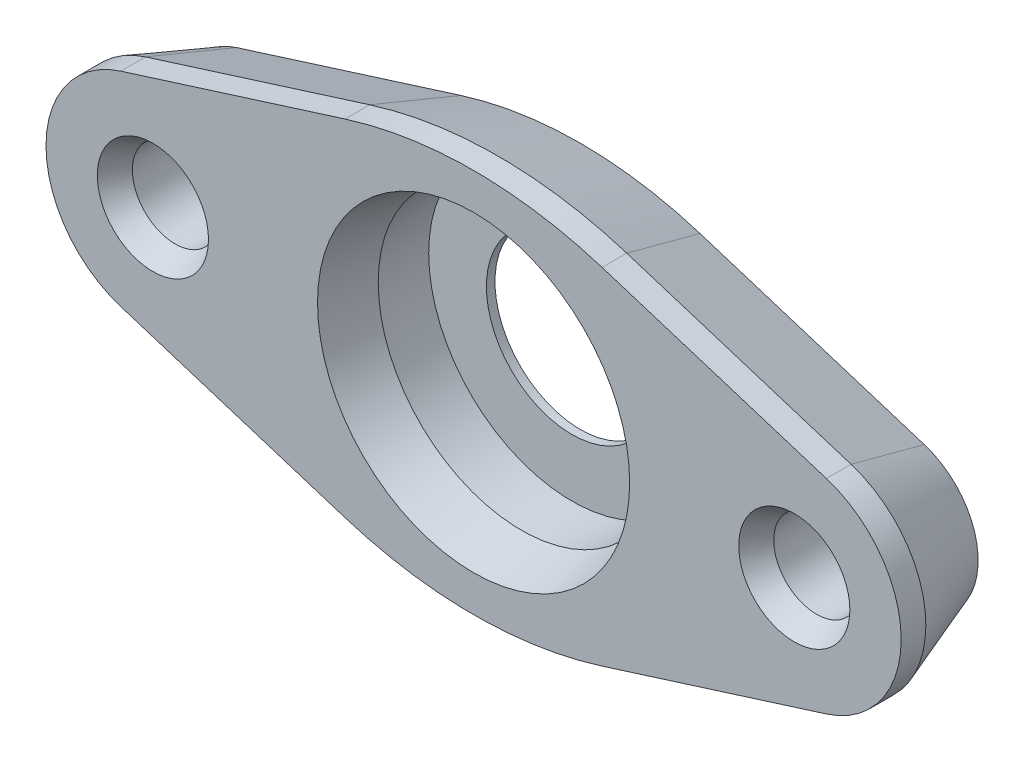
ISO-10303-21;
HEADER;
FILE_DESCRIPTION(('STEP AP214'),'2;1');
FILE_NAME('part.step','',(''),(''),'','','');
FILE_SCHEMA(('AUTOMOTIVE_DESIGN { 1 0 10303 214 1 1 1 1 }'));
ENDSEC;
DATA;
#1=APPLICATION_CONTEXT('core data for automotive mechanical design processes');
#2=APPLICATION_PROTOCOL_DEFINITION('international standard','automotive_design',2000,#1);
#3=PRODUCT_CONTEXT('',#1,'mechanical');
#4=PRODUCT('Part','Part','',(#3));
#5=PRODUCT_RELATED_PRODUCT_CATEGORY('part','',(#4));
#6=PRODUCT_DEFINITION_FORMATION('','',#4);
#7=PRODUCT_DEFINITION_CONTEXT('part definition',#1,'design');
#8=PRODUCT_DEFINITION('design','',#6,#7);
#9=PRODUCT_DEFINITION_SHAPE('','',#8);
#10=(LENGTH_UNIT() NAMED_UNIT(*) SI_UNIT(.MILLI.,.METRE.));
#11=(NAMED_UNIT(*) PLANE_ANGLE_UNIT() SI_UNIT($,.RADIAN.));
#12=(NAMED_UNIT(*) SI_UNIT($,.STERADIAN.) SOLID_ANGLE_UNIT());
#13=UNCERTAINTY_MEASURE_WITH_UNIT(LENGTH_MEASURE(1.E-05),#10,'distance_accuracy_value','');
#14=(GEOMETRIC_REPRESENTATION_CONTEXT(3) GLOBAL_UNCERTAINTY_ASSIGNED_CONTEXT((#13)) GLOBAL_UNIT_ASSIGNED_CONTEXT((#10,
#11,#12)) REPRESENTATION_CONTEXT('',''));
#15=CARTESIAN_POINT('',(0.,0.,0.));
#16=DIRECTION('',(0.,0.,1.));
#17=DIRECTION('',(1.,0.,0.));
#18=AXIS2_PLACEMENT_3D('',#15,#16,#17);
#19=CARTESIAN_POINT('',(-7.5,0.,2.5));
#20=DIRECTION('',(0.,0.,1.));
#21=DIRECTION('',(1.,0.,0.));
#22=AXIS2_PLACEMENT_3D('',#19,#20,#21);
#23=PLANE('',#22);
#24=CARTESIAN_POINT('',(7.5,0.,2.5));
#25=DIRECTION('',(0.,0.,1.));
#26=DIRECTION('',(1.,0.,0.));
#27=AXIS2_PLACEMENT_3D('',#24,#25,#26);
#28=CIRCLE('',#27,1.3);
#29=CARTESIAN_POINT('',(8.8,0.,2.5));
#30=VERTEX_POINT('',#29);
#31=EDGE_CURVE('E44',#30,#30,#28,.F.);
#32=ORIENTED_EDGE('',*,*,#31,.T.);
#33=EDGE_LOOP('',(#32));
#34=FACE_BOUND('',#33,.T.);
#35=CARTESIAN_POINT('',(-7.5,0.,2.5));
#36=DIRECTION('',(0.,0.,1.));
#37=DIRECTION('',(1.,0.,0.));
#38=AXIS2_PLACEMENT_3D('',#35,#36,#37);
#39=CIRCLE('',#38,1.3);
#40=CARTESIAN_POINT('',(-6.2,0.,2.5));
#41=VERTEX_POINT('',#40);
#42=EDGE_CURVE('E219',#41,#41,#39,.F.);
#43=ORIENTED_EDGE('',*,*,#42,.T.);
#44=EDGE_LOOP('',(#43));
#45=FACE_BOUND('',#44,.T.);
#46=CARTESIAN_POINT('',(0.,0.,2.5));
#47=DIRECTION('',(0.,0.,1.));
#48=DIRECTION('',(1.,0.,0.));
#49=AXIS2_PLACEMENT_3D('',#46,#47,#48);
#50=CIRCLE('',#49,3.65);
#51=CARTESIAN_POINT('',(3.65,0.,2.5));
#52=VERTEX_POINT('',#51);
#53=EDGE_CURVE('E213',#52,#52,#50,.F.);
#54=ORIENTED_EDGE('',*,*,#53,.T.);
#55=EDGE_LOOP('',(#54));
#56=FACE_BOUND('',#55,.T.);
#57=CARTESIAN_POINT('',(-7.5,0.,2.5));
#58=DIRECTION('',(0.,0.,1.));
#59=DIRECTION('',(1.,0.,0.));
#60=AXIS2_PLACEMENT_3D('',#57,#58,#59);
#61=CIRCLE('',#60,2.5);
#62=CARTESIAN_POINT('',(-8.25144508670521,2.38439306358381,2.5));
#63=VERTEX_POINT('',#62);
#64=CARTESIAN_POINT('',(-8.2514450867052,-2.38439306358382,2.5));
#65=VERTEX_POINT('',#64);
#66=EDGE_CURVE('E138',#63,#65,#61,.T.);
#67=ORIENTED_EDGE('',*,*,#66,.T.);
#68=DIRECTION('',(0.953757225433526,-0.300578034682081,0.));
#69=VECTOR('',#68,1.);
#70=CARTESIAN_POINT('',(-8.2514450867052,-2.38439306358382,2.5));
#71=LINE('',#70,#69);
#72=CARTESIAN_POINT('',(-3.00578034682081,-4.03757225433526,2.5));
#73=VERTEX_POINT('',#72);
#74=EDGE_CURVE('E128',#65,#73,#71,.T.);
#75=ORIENTED_EDGE('',*,*,#74,.T.);
#76=CARTESIAN_POINT('',(0.,5.5,2.5));
#77=DIRECTION('',(0.,0.,1.));
#78=DIRECTION('',(1.,0.,0.));
#79=AXIS2_PLACEMENT_3D('',#76,#77,#78);
#80=CIRCLE('',#79,10.);
#81=CARTESIAN_POINT('',(3.00578034682081,-4.03757225433526,2.5));
#82=VERTEX_POINT('',#81);
#83=EDGE_CURVE('E137',#73,#82,#80,.T.);
#84=ORIENTED_EDGE('',*,*,#83,.T.);
#85=DIRECTION('',(0.953757225433526,0.300578034682081,0.));
#86=VECTOR('',#85,1.);
#87=CARTESIAN_POINT('',(3.00578034682081,-4.03757225433526,2.5));
#88=LINE('',#87,#86);
#89=CARTESIAN_POINT('',(8.25144508670521,-2.38439306358381,2.5));
#90=VERTEX_POINT('',#89);
#91=EDGE_CURVE('E249',#82,#90,#88,.T.);
#92=ORIENTED_EDGE('',*,*,#91,.T.);
#93=CARTESIAN_POINT('',(7.5,0.,2.5));
#94=DIRECTION('',(0.,0.,1.));
#95=DIRECTION('',(1.,0.,0.));
#96=AXIS2_PLACEMENT_3D('',#93,#94,#95);
#97=CIRCLE('',#96,2.5);
#98=CARTESIAN_POINT('',(8.25144508670521,2.38439306358382,2.5));
#99=VERTEX_POINT('',#98);
#100=EDGE_CURVE('E251',#90,#99,#97,.T.);
#101=ORIENTED_EDGE('',*,*,#100,.T.);
#102=DIRECTION('',(-0.953757225433526,0.300578034682081,0.));
#103=VECTOR('',#102,1.);
#104=CARTESIAN_POINT('',(3.00578034682081,4.03757225433526,2.5));
#105=LINE('',#104,#103);
#106=CARTESIAN_POINT('',(3.00578034682081,4.03757225433526,2.5));
#107=VERTEX_POINT('',#106);
#108=EDGE_CURVE('E253',#99,#107,#105,.T.);
#109=ORIENTED_EDGE('',*,*,#108,.T.);
#110=CARTESIAN_POINT('',(0.,-5.5,2.5));
#111=DIRECTION('',(0.,0.,1.));
#112=DIRECTION('',(-1.,0.,0.));
#113=AXIS2_PLACEMENT_3D('',#110,#111,#112);
#114=CIRCLE('',#113,10.);
#115=CARTESIAN_POINT('',(-3.00578034682081,4.03757225433526,2.5));
#116=VERTEX_POINT('',#115);
#117=EDGE_CURVE('E255',#107,#116,#114,.T.);
#118=ORIENTED_EDGE('',*,*,#117,.T.);
#119=DIRECTION('',(-0.953757225433526,-0.300578034682081,0.));
#120=VECTOR('',#119,1.);
#121=CARTESIAN_POINT('',(-8.25144508670521,2.38439306358381,2.5));
#122=LINE('',#121,#120);
#123=EDGE_CURVE('E142',#116,#63,#122,.T.);
#124=ORIENTED_EDGE('',*,*,#123,.T.);
#125=EDGE_LOOP('',(#67,#75,#84,#92,#101,#109,#118,#124));
#126=FACE_BOUND('',#125,.T.);
#127=ADVANCED_FACE('F35',(#34,#45,#56,#126),#23,.T.);
#128=CARTESIAN_POINT('',(-7.5,0.,0.));
#129=DIRECTION('',(0.,0.,1.));
#130=DIRECTION('',(1.,0.,0.));
#131=AXIS2_PLACEMENT_3D('',#128,#129,#130);
#132=PLANE('',#131);
#133=CARTESIAN_POINT('',(0.,0.,0.));
#134=DIRECTION('',(0.,0.,1.));
#135=DIRECTION('',(1.,0.,0.));
#136=AXIS2_PLACEMENT_3D('',#133,#134,#135);
#137=CIRCLE('',#136,2.);
#138=CARTESIAN_POINT('',(2.,0.,0.));
#139=VERTEX_POINT('',#138);
#140=EDGE_CURVE('E39',#139,#139,#137,.T.);
#141=ORIENTED_EDGE('',*,*,#140,.T.);
#142=EDGE_LOOP('',(#141));
#143=FACE_BOUND('',#142,.T.);
#144=CARTESIAN_POINT('',(-7.5,0.,0.));
#145=DIRECTION('',(0.,0.,1.));
#146=DIRECTION('',(1.,0.,0.));
#147=AXIS2_PLACEMENT_3D('',#144,#145,#146);
#148=CIRCLE('',#147,1.8);
#149=CARTESIAN_POINT('',(-8.04104046242774,-1.71676300578035,0.));
#150=VERTEX_POINT('',#149);
#151=CARTESIAN_POINT('',(-8.04104046242775,1.71676300578034,0.));
#152=VERTEX_POINT('',#151);
#153=EDGE_CURVE('E171',#150,#152,#148,.F.);
#154=ORIENTED_EDGE('',*,*,#153,.T.);
#155=DIRECTION('',(0.953757225433526,0.300578034682081,0.));
#156=VECTOR('',#155,1.);
#157=CARTESIAN_POINT('',(-8.04104046242774,1.71676300578034,0.));
#158=LINE('',#157,#156);
#159=CARTESIAN_POINT('',(-2.79537572254335,3.36994219653179,0.));
#160=VERTEX_POINT('',#159);
#161=EDGE_CURVE('E173',#152,#160,#158,.T.);
#162=ORIENTED_EDGE('',*,*,#161,.T.);
#163=CARTESIAN_POINT('',(0.,-5.5,0.));
#164=DIRECTION('',(0.,0.,1.));
#165=DIRECTION('',(1.,0.,0.));
#166=AXIS2_PLACEMENT_3D('',#163,#164,#165);
#167=CIRCLE('',#166,9.3);
#168=CARTESIAN_POINT('',(2.79537572254335,3.36994219653179,0.));
#169=VERTEX_POINT('',#168);
#170=EDGE_CURVE('E169',#160,#169,#167,.F.);
#171=ORIENTED_EDGE('',*,*,#170,.T.);
#172=DIRECTION('',(0.953757225433526,-0.300578034682081,0.));
#173=VECTOR('',#172,1.);
#174=CARTESIAN_POINT('',(-5.60375221357212,6.01694009155,0.));
#175=LINE('',#174,#173);
#176=CARTESIAN_POINT('',(8.04104046242775,1.71676300578034,0.));
#177=VERTEX_POINT('',#176);
#178=EDGE_CURVE('E165',#169,#177,#175,.T.);
#179=ORIENTED_EDGE('',*,*,#178,.T.);
#180=CARTESIAN_POINT('',(7.5,0.,0.));
#181=DIRECTION('',(0.,0.,1.));
#182=DIRECTION('',(1.,0.,0.));
#183=AXIS2_PLACEMENT_3D('',#180,#181,#182);
#184=CIRCLE('',#183,1.8);
#185=CARTESIAN_POINT('',(8.04104046242775,-1.71676300578034,0.));
#186=VERTEX_POINT('',#185);
#187=EDGE_CURVE('E161',#177,#186,#184,.F.);
#188=ORIENTED_EDGE('',*,*,#187,.T.);
#189=DIRECTION('',(-0.953757225433526,-0.300578034682081,0.));
#190=VECTOR('',#189,1.);
#191=CARTESIAN_POINT('',(-5.60375221357212,-6.01694009155,0.));
#192=LINE('',#191,#190);
#193=CARTESIAN_POINT('',(2.79537572254335,-3.36994219653179,0.));
#194=VERTEX_POINT('',#193);
#195=EDGE_CURVE('E154',#186,#194,#192,.T.);
#196=ORIENTED_EDGE('',*,*,#195,.T.);
#197=CARTESIAN_POINT('',(0.,5.5,0.));
#198=DIRECTION('',(0.,0.,1.));
#199=DIRECTION('',(1.,0.,0.));
#200=AXIS2_PLACEMENT_3D('',#197,#198,#199);
#201=CIRCLE('',#200,9.3);
#202=CARTESIAN_POINT('',(-2.79537572254335,-3.36994219653179,0.));
#203=VERTEX_POINT('',#202);
#204=EDGE_CURVE('E163',#194,#203,#201,.F.);
#205=ORIENTED_EDGE('',*,*,#204,.T.);
#206=DIRECTION('',(-0.953757225433526,0.300578034682081,0.));
#207=VECTOR('',#206,1.);
#208=CARTESIAN_POINT('',(-8.04104046242774,-1.71676300578035,0.));
#209=LINE('',#208,#207);
#210=EDGE_CURVE('E167',#203,#150,#209,.T.);
#211=ORIENTED_EDGE('',*,*,#210,.T.);
#212=EDGE_LOOP('',(#154,#162,#171,#179,#188,#196,#205,#211));
#213=FACE_BOUND('',#212,.T.);
#214=CARTESIAN_POINT('',(7.5,0.,0.));
#215=DIRECTION('',(0.,0.,1.));
#216=DIRECTION('',(1.,0.,0.));
#217=AXIS2_PLACEMENT_3D('',#214,#215,#216);
#218=CIRCLE('',#217,1.);
#219=CARTESIAN_POINT('',(8.5,0.,0.));
#220=VERTEX_POINT('',#219);
#221=EDGE_CURVE('E146',#220,#220,#218,.T.);
#222=ORIENTED_EDGE('',*,*,#221,.T.);
#223=EDGE_LOOP('',(#222));
#224=FACE_BOUND('',#223,.T.);
#225=CARTESIAN_POINT('',(-7.5,0.,0.));
#226=DIRECTION('',(0.,0.,1.));
#227=DIRECTION('',(1.,0.,0.));
#228=AXIS2_PLACEMENT_3D('',#225,#226,#227);
#229=CIRCLE('',#228,1.);
#230=CARTESIAN_POINT('',(-6.5,0.,0.));
#231=VERTEX_POINT('',#230);
#232=EDGE_CURVE('E242',#231,#231,#229,.T.);
#233=ORIENTED_EDGE('',*,*,#232,.T.);
#234=EDGE_LOOP('',(#233));
#235=FACE_BOUND('',#234,.T.);
#236=ADVANCED_FACE('F284',(#143,#213,#224,#235),#132,.F.);
#237=CARTESIAN_POINT('',(-7.5,0.,2.5));
#238=DIRECTION('',(0.,0.,-1.));
#239=DIRECTION('',(-1.,0.,0.));
#240=AXIS2_PLACEMENT_3D('',#237,#238,#239);
#241=CYLINDRICAL_SURFACE('',#240,2.5);
#242=DIRECTION('',(0.,0.,-1.));
#243=VECTOR('',#242,1.);
#244=CARTESIAN_POINT('',(-8.25144508670521,2.38439306358381,2.5));
#245=LINE('',#244,#243);
#246=CARTESIAN_POINT('',(-8.25144508670521,2.38439306358381,1.92323419361825));
#247=VERTEX_POINT('',#246);
#248=EDGE_CURVE('E258',#63,#247,#245,.T.);
#249=ORIENTED_EDGE('',*,*,#248,.T.);
#250=CARTESIAN_POINT('',(-7.5,0.,1.92323419361825));
#251=DIRECTION('',(0.,0.,1.));
#252=DIRECTION('',(1.,0.,0.));
#253=AXIS2_PLACEMENT_3D('',#250,#251,#252);
#254=CIRCLE('',#253,2.5);
#255=CARTESIAN_POINT('',(-8.2514450867052,-2.38439306358382,1.92323419361825));
#256=VERTEX_POINT('',#255);
#257=EDGE_CURVE('E150',#247,#256,#254,.T.);
#258=ORIENTED_EDGE('',*,*,#257,.T.);
#259=DIRECTION('',(0.,0.,-1.));
#260=VECTOR('',#259,1.);
#261=CARTESIAN_POINT('',(-8.2514450867052,-2.38439306358382,2.5));
#262=LINE('',#261,#260);
#263=EDGE_CURVE('E132',#65,#256,#262,.T.);
#264=ORIENTED_EDGE('',*,*,#263,.F.);
#265=ORIENTED_EDGE('',*,*,#66,.F.);
#266=EDGE_LOOP('',(#249,#258,#264,#265));
#267=FACE_BOUND('',#266,.T.);
#268=ADVANCED_FACE('F148',(#267),#241,.T.);
#269=CARTESIAN_POINT('',(-8.2514450867052,-2.38439306358382,2.5));
#270=DIRECTION('',(0.300578034682081,0.953757225433526,0.));
#271=DIRECTION('',(-0.953757225433526,0.300578034682081,0.));
#272=AXIS2_PLACEMENT_3D('',#269,#270,#271);
#273=PLANE('',#272);
#274=ORIENTED_EDGE('',*,*,#263,.T.);
#275=DIRECTION('',(0.953757225433526,-0.300578034682081,0.));
#276=VECTOR('',#275,1.);
#277=CARTESIAN_POINT('',(-8.2514450867052,-2.38439306358382,1.92323419361825));
#278=LINE('',#277,#276);
#279=CARTESIAN_POINT('',(-3.00578034682081,-4.03757225433526,1.92323419361825));
#280=VERTEX_POINT('',#279);
#281=EDGE_CURVE('E179',#256,#280,#278,.T.);
#282=ORIENTED_EDGE('',*,*,#281,.T.);
#283=DIRECTION('',(0.,0.,-1.));
#284=VECTOR('',#283,1.);
#285=CARTESIAN_POINT('',(-3.00578034682081,-4.03757225433526,2.5));
#286=LINE('',#285,#284);
#287=EDGE_CURVE('E134',#73,#280,#286,.T.);
#288=ORIENTED_EDGE('',*,*,#287,.F.);
#289=ORIENTED_EDGE('',*,*,#74,.F.);
#290=EDGE_LOOP('',(#274,#282,#288,#289));
#291=FACE_BOUND('',#290,.T.);
#292=ADVANCED_FACE('F130',(#291),#273,.F.);
#293=CARTESIAN_POINT('',(0.,5.5,2.5));
#294=DIRECTION('',(0.,0.,-1.));
#295=DIRECTION('',(-1.,0.,0.));
#296=AXIS2_PLACEMENT_3D('',#293,#294,#295);
#297=CYLINDRICAL_SURFACE('',#296,10.);
#298=ORIENTED_EDGE('',*,*,#287,.T.);
#299=CARTESIAN_POINT('',(0.,5.5,1.92323419361825));
#300=DIRECTION('',(0.,0.,1.));
#301=DIRECTION('',(1.,0.,0.));
#302=AXIS2_PLACEMENT_3D('',#299,#300,#301);
#303=CIRCLE('',#302,10.);
#304=CARTESIAN_POINT('',(3.00578034682081,-4.03757225433526,1.92323419361825));
#305=VERTEX_POINT('',#304);
#306=EDGE_CURVE('E59',#280,#305,#303,.T.);
#307=ORIENTED_EDGE('',*,*,#306,.T.);
#308=DIRECTION('',(0.,0.,-1.));
#309=VECTOR('',#308,1.);
#310=CARTESIAN_POINT('',(3.00578034682081,-4.03757225433526,2.5));
#311=LINE('',#310,#309);
#312=EDGE_CURVE('E156',#82,#305,#311,.T.);
#313=ORIENTED_EDGE('',*,*,#312,.F.);
#314=ORIENTED_EDGE('',*,*,#83,.F.);
#315=EDGE_LOOP('',(#298,#307,#313,#314));
#316=FACE_BOUND('',#315,.T.);
#317=ADVANCED_FACE('F301',(#316),#297,.T.);
#318=CARTESIAN_POINT('',(3.00578034682081,-4.03757225433526,2.5));
#319=DIRECTION('',(-0.300578034682081,0.953757225433526,0.));
#320=DIRECTION('',(-0.953757225433526,-0.300578034682081,0.));
#321=AXIS2_PLACEMENT_3D('',#318,#319,#320);
#322=PLANE('',#321);
#323=ORIENTED_EDGE('',*,*,#312,.T.);
#324=DIRECTION('',(0.953757225433526,0.300578034682081,0.));
#325=VECTOR('',#324,1.);
#326=CARTESIAN_POINT('',(3.00578034682081,-4.03757225433526,1.92323419361825));
#327=LINE('',#326,#325);
#328=CARTESIAN_POINT('',(8.25144508670521,-2.38439306358381,1.92323419361825));
#329=VERTEX_POINT('',#328);
#330=EDGE_CURVE('E51',#305,#329,#327,.T.);
#331=ORIENTED_EDGE('',*,*,#330,.T.);
#332=DIRECTION('',(0.,0.,-1.));
#333=VECTOR('',#332,1.);
#334=CARTESIAN_POINT('',(8.25144508670521,-2.38439306358381,2.5));
#335=LINE('',#334,#333);
#336=EDGE_CURVE('E269',#90,#329,#335,.T.);
#337=ORIENTED_EDGE('',*,*,#336,.F.);
#338=ORIENTED_EDGE('',*,*,#91,.F.);
#339=EDGE_LOOP('',(#323,#331,#337,#338));
#340=FACE_BOUND('',#339,.T.);
#341=ADVANCED_FACE('F271',(#340),#322,.F.);
#342=CARTESIAN_POINT('',(7.5,0.,2.5));
#343=DIRECTION('',(0.,0.,-1.));
#344=DIRECTION('',(-1.,0.,0.));
#345=AXIS2_PLACEMENT_3D('',#342,#343,#344);
#346=CYLINDRICAL_SURFACE('',#345,2.5);
#347=ORIENTED_EDGE('',*,*,#336,.T.);
#348=CARTESIAN_POINT('',(7.5,0.,1.92323419361825));
#349=DIRECTION('',(0.,0.,1.));
#350=DIRECTION('',(1.,0.,0.));
#351=AXIS2_PLACEMENT_3D('',#348,#349,#350);
#352=CIRCLE('',#351,2.5);
#353=CARTESIAN_POINT('',(8.25144508670521,2.38439306358382,1.92323419361825));
#354=VERTEX_POINT('',#353);
#355=EDGE_CURVE('E184',#329,#354,#352,.T.);
#356=ORIENTED_EDGE('',*,*,#355,.T.);
#357=DIRECTION('',(0.,0.,-1.));
#358=VECTOR('',#357,1.);
#359=CARTESIAN_POINT('',(8.25144508670521,2.38439306358382,2.5));
#360=LINE('',#359,#358);
#361=EDGE_CURVE('E266',#99,#354,#360,.T.);
#362=ORIENTED_EDGE('',*,*,#361,.F.);
#363=ORIENTED_EDGE('',*,*,#100,.F.);
#364=EDGE_LOOP('',(#347,#356,#362,#363));
#365=FACE_BOUND('',#364,.T.);
#366=ADVANCED_FACE('F293',(#365),#346,.T.);
#367=CARTESIAN_POINT('',(3.00578034682081,4.03757225433526,2.5));
#368=DIRECTION('',(-0.300578034682081,-0.953757225433526,0.));
#369=DIRECTION('',(0.953757225433526,-0.300578034682081,0.));
#370=AXIS2_PLACEMENT_3D('',#367,#368,#369);
#371=PLANE('',#370);
#372=ORIENTED_EDGE('',*,*,#361,.T.);
#373=DIRECTION('',(-0.953757225433526,0.300578034682081,0.));
#374=VECTOR('',#373,1.);
#375=CARTESIAN_POINT('',(3.00578034682081,4.03757225433526,1.92323419361825));
#376=LINE('',#375,#374);
#377=CARTESIAN_POINT('',(3.00578034682081,4.03757225433526,1.92323419361825));
#378=VERTEX_POINT('',#377);
#379=EDGE_CURVE('E181',#354,#378,#376,.T.);
#380=ORIENTED_EDGE('',*,*,#379,.T.);
#381=DIRECTION('',(0.,0.,-1.));
#382=VECTOR('',#381,1.);
#383=CARTESIAN_POINT('',(3.00578034682081,4.03757225433526,2.5));
#384=LINE('',#383,#382);
#385=EDGE_CURVE('E263',#107,#378,#384,.T.);
#386=ORIENTED_EDGE('',*,*,#385,.F.);
#387=ORIENTED_EDGE('',*,*,#108,.F.);
#388=EDGE_LOOP('',(#372,#380,#386,#387));
#389=FACE_BOUND('',#388,.T.);
#390=ADVANCED_FACE('F297',(#389),#371,.F.);
#391=CARTESIAN_POINT('',(0.,-5.5,2.5));
#392=DIRECTION('',(0.,0.,-1.));
#393=DIRECTION('',(-1.,0.,0.));
#394=AXIS2_PLACEMENT_3D('',#391,#392,#393);
#395=CYLINDRICAL_SURFACE('',#394,10.);
#396=ORIENTED_EDGE('',*,*,#385,.T.);
#397=CARTESIAN_POINT('',(0.,-5.5,1.92323419361825));
#398=DIRECTION('',(0.,0.,1.));
#399=DIRECTION('',(1.,0.,0.));
#400=AXIS2_PLACEMENT_3D('',#397,#398,#399);
#401=CIRCLE('',#400,10.);
#402=CARTESIAN_POINT('',(-3.00578034682081,4.03757225433526,1.92323419361825));
#403=VERTEX_POINT('',#402);
#404=EDGE_CURVE('E177',#378,#403,#401,.T.);
#405=ORIENTED_EDGE('',*,*,#404,.T.);
#406=DIRECTION('',(0.,0.,-1.));
#407=VECTOR('',#406,1.);
#408=CARTESIAN_POINT('',(-3.00578034682081,4.03757225433526,2.5));
#409=LINE('',#408,#407);
#410=EDGE_CURVE('E260',#116,#403,#409,.T.);
#411=ORIENTED_EDGE('',*,*,#410,.F.);
#412=ORIENTED_EDGE('',*,*,#117,.F.);
#413=EDGE_LOOP('',(#396,#405,#411,#412));
#414=FACE_BOUND('',#413,.T.);
#415=ADVANCED_FACE('F321',(#414),#395,.T.);
#416=CARTESIAN_POINT('',(-8.25144508670521,2.38439306358381,2.5));
#417=DIRECTION('',(0.300578034682081,-0.953757225433526,0.));
#418=DIRECTION('',(0.953757225433526,0.300578034682081,0.));
#419=AXIS2_PLACEMENT_3D('',#416,#417,#418);
#420=PLANE('',#419);
#421=ORIENTED_EDGE('',*,*,#410,.T.);
#422=DIRECTION('',(-0.953757225433526,-0.300578034682081,0.));
#423=VECTOR('',#422,1.);
#424=CARTESIAN_POINT('',(-8.25144508670521,2.38439306358381,1.92323419361825));
#425=LINE('',#424,#423);
#426=EDGE_CURVE('E151',#403,#247,#425,.T.);
#427=ORIENTED_EDGE('',*,*,#426,.T.);
#428=ORIENTED_EDGE('',*,*,#248,.F.);
#429=ORIENTED_EDGE('',*,*,#123,.F.);
#430=EDGE_LOOP('',(#421,#427,#428,#429));
#431=FACE_BOUND('',#430,.T.);
#432=ADVANCED_FACE('F237',(#431),#420,.F.);
#433=CARTESIAN_POINT('',(7.5,0.,2.5));
#434=DIRECTION('',(0.,0.,-1.));
#435=DIRECTION('',(-1.,0.,0.));
#436=AXIS2_PLACEMENT_3D('',#433,#434,#435);
#437=CYLINDRICAL_SURFACE('',#436,1.);
#438=CARTESIAN_POINT('',(7.5,0.,1.98038475772934));
#439=DIRECTION('',(0.,0.,1.));
#440=DIRECTION('',(1.,0.,0.));
#441=AXIS2_PLACEMENT_3D('',#438,#439,#440);
#442=CIRCLE('',#441,1.);
#443=CARTESIAN_POINT('',(8.5,0.,1.98038475772934));
#444=VERTEX_POINT('',#443);
#445=EDGE_CURVE('E216',#444,#444,#442,.T.);
#446=ORIENTED_EDGE('',*,*,#445,.T.);
#447=EDGE_LOOP('',(#446));
#448=FACE_BOUND('',#447,.T.);
#449=ORIENTED_EDGE('',*,*,#221,.F.);
#450=EDGE_LOOP('',(#449));
#451=FACE_BOUND('',#450,.T.);
#452=ADVANCED_FACE('F233',(#448,#451),#437,.F.);
#453=CARTESIAN_POINT('',(-7.5,0.,2.5));
#454=DIRECTION('',(0.,0.,-1.));
#455=DIRECTION('',(-1.,0.,0.));
#456=AXIS2_PLACEMENT_3D('',#453,#454,#455);
#457=CYLINDRICAL_SURFACE('',#456,1.);
#458=CARTESIAN_POINT('',(-7.5,0.,1.98038475772934));
#459=DIRECTION('',(0.,0.,1.));
#460=DIRECTION('',(1.,0.,0.));
#461=AXIS2_PLACEMENT_3D('',#458,#459,#460);
#462=CIRCLE('',#461,1.);
#463=CARTESIAN_POINT('',(-6.5,0.,1.98038475772934));
#464=VERTEX_POINT('',#463);
#465=EDGE_CURVE('E11',#464,#464,#462,.T.);
#466=ORIENTED_EDGE('',*,*,#465,.T.);
#467=EDGE_LOOP('',(#466));
#468=FACE_BOUND('',#467,.T.);
#469=ORIENTED_EDGE('',*,*,#232,.F.);
#470=EDGE_LOOP('',(#469));
#471=FACE_BOUND('',#470,.T.);
#472=ADVANCED_FACE('F236',(#468,#471),#457,.F.);
#473=CARTESIAN_POINT('',(0.,0.,0.2));
#474=DIRECTION('',(0.,0.,1.));
#475=DIRECTION('',(1.,0.,0.));
#476=AXIS2_PLACEMENT_3D('',#473,#474,#475);
#477=CYLINDRICAL_SURFACE('',#476,3.35);
#478=CARTESIAN_POINT('',(0.,0.,1.38038475772935));
#479=DIRECTION('',(0.,0.,1.));
#480=DIRECTION('',(1.,0.,0.));
#481=AXIS2_PLACEMENT_3D('',#478,#479,#480);
#482=CIRCLE('',#481,3.35);
#483=CARTESIAN_POINT('',(3.35,0.,1.38038475772935));
#484=VERTEX_POINT('',#483);
#485=EDGE_CURVE('E187',#484,#484,#482,.T.);
#486=ORIENTED_EDGE('',*,*,#485,.T.);
#487=EDGE_LOOP('',(#486));
#488=FACE_BOUND('',#487,.T.);
#489=CARTESIAN_POINT('',(0.,0.,0.2));
#490=DIRECTION('',(0.,0.,1.));
#491=DIRECTION('',(1.,0.,0.));
#492=AXIS2_PLACEMENT_3D('',#489,#490,#491);
#493=CIRCLE('',#492,3.35);
#494=CARTESIAN_POINT('',(3.35,0.,0.2));
#495=VERTEX_POINT('',#494);
#496=EDGE_CURVE('E210',#495,#495,#493,.T.);
#497=ORIENTED_EDGE('',*,*,#496,.F.);
#498=EDGE_LOOP('',(#497));
#499=FACE_BOUND('',#498,.T.);
#500=ADVANCED_FACE('F356',(#488,#499),#477,.F.);
#501=CARTESIAN_POINT('',(0.,0.,0.2));
#502=DIRECTION('',(0.,0.,1.));
#503=DIRECTION('',(1.,0.,0.));
#504=AXIS2_PLACEMENT_3D('',#501,#502,#503);
#505=PLANE('',#504);
#506=CARTESIAN_POINT('',(0.,0.,0.2));
#507=DIRECTION('',(0.,0.,1.));
#508=DIRECTION('',(1.,0.,0.));
#509=AXIS2_PLACEMENT_3D('',#506,#507,#508);
#510=CIRCLE('',#509,2.);
#511=CARTESIAN_POINT('',(2.,0.,0.2));
#512=VERTEX_POINT('',#511);
#513=EDGE_CURVE('E531',#512,#512,#510,.T.);
#514=ORIENTED_EDGE('',*,*,#513,.F.);
#515=EDGE_LOOP('',(#514));
#516=FACE_BOUND('',#515,.T.);
#517=ORIENTED_EDGE('',*,*,#496,.T.);
#518=EDGE_LOOP('',(#517));
#519=FACE_BOUND('',#518,.T.);
#520=ADVANCED_FACE('F364',(#516,#519),#505,.T.);
#521=CARTESIAN_POINT('',(3.00578034682081,-4.03757225433526,1.92323419361825));
#522=DIRECTION('',(-0.282450961161083,0.896238626761127,0.342020143325668));
#523=DIRECTION('',(0.953757225433526,0.300578034682081,0.));
#524=AXIS2_PLACEMENT_3D('',#521,#522,#523);
#525=PLANE('',#524);
#526=DIRECTION('',(0.102803742502513,-0.326204182940666,0.939692620785909));
#527=VECTOR('',#526,1.);
#528=CARTESIAN_POINT('',(2.79537572254335,-3.36994219653179,0.));
#529=LINE('',#528,#527);
#530=EDGE_CURVE('E204',#194,#305,#529,.T.);
#531=ORIENTED_EDGE('',*,*,#530,.F.);
#532=ORIENTED_EDGE('',*,*,#195,.F.);
#533=DIRECTION('',(-0.102803742502514,0.326204182940666,-0.939692620785909));
#534=VECTOR('',#533,1.);
#535=CARTESIAN_POINT('',(8.25144508670521,-2.38439306358381,1.92323419361825));
#536=LINE('',#535,#534);
#537=EDGE_CURVE('E207',#329,#186,#536,.T.);
#538=ORIENTED_EDGE('',*,*,#537,.F.);
#539=ORIENTED_EDGE('',*,*,#330,.F.);
#540=EDGE_LOOP('',(#531,#532,#538,#539));
#541=FACE_BOUND('',#540,.T.);
#542=ADVANCED_FACE('F275',(#541),#525,.F.);
#543=CARTESIAN_POINT('',(7.5,0.,1.92323419361825));
#544=DIRECTION('',(0.,0.,1.));
#545=DIRECTION('',(1.,0.,0.));
#546=AXIS2_PLACEMENT_3D('',#543,#544,#545);
#547=CONICAL_SURFACE('',#546,2.5,0.349065850398866);
#548=ORIENTED_EDGE('',*,*,#537,.T.);
#549=ORIENTED_EDGE('',*,*,#187,.F.);
#550=DIRECTION('',(-0.102803742502513,-0.326204182940666,-0.939692620785909));
#551=VECTOR('',#550,1.);
#552=CARTESIAN_POINT('',(8.25144508670521,2.38439306358382,1.92323419361825));
#553=LINE('',#552,#551);
#554=EDGE_CURVE('E201',#354,#177,#553,.T.);
#555=ORIENTED_EDGE('',*,*,#554,.F.);
#556=ORIENTED_EDGE('',*,*,#355,.F.);
#557=EDGE_LOOP('',(#548,#549,#555,#556));
#558=FACE_BOUND('',#557,.T.);
#559=ADVANCED_FACE('F288',(#558),#547,.T.);
#560=CARTESIAN_POINT('',(0.,5.5,1.92323419361825));
#561=DIRECTION('',(0.,0.,1.));
#562=DIRECTION('',(1.,0.,0.));
#563=AXIS2_PLACEMENT_3D('',#560,#561,#562);
#564=CONICAL_SURFACE('',#563,10.,0.349065850398865);
#565=ORIENTED_EDGE('',*,*,#530,.T.);
#566=ORIENTED_EDGE('',*,*,#306,.F.);
#567=DIRECTION('',(-0.102803742502513,-0.326204182940666,0.939692620785909));
#568=VECTOR('',#567,1.);
#569=CARTESIAN_POINT('',(-2.79537572254335,-3.36994219653179,0.));
#570=LINE('',#569,#568);
#571=EDGE_CURVE('E198',#203,#280,#570,.T.);
#572=ORIENTED_EDGE('',*,*,#571,.F.);
#573=ORIENTED_EDGE('',*,*,#204,.F.);
#574=EDGE_LOOP('',(#565,#566,#572,#573));
#575=FACE_BOUND('',#574,.T.);
#576=ADVANCED_FACE('F280',(#575),#564,.T.);
#577=CARTESIAN_POINT('',(3.00578034682081,4.03757225433526,1.92323419361825));
#578=DIRECTION('',(-0.282450961161083,-0.896238626761127,0.342020143325668));
#579=DIRECTION('',(-0.953757225433526,0.300578034682081,0.));
#580=AXIS2_PLACEMENT_3D('',#577,#578,#579);
#581=PLANE('',#580);
#582=ORIENTED_EDGE('',*,*,#554,.T.);
#583=ORIENTED_EDGE('',*,*,#178,.F.);
#584=DIRECTION('',(-0.102803742502513,-0.326204182940666,-0.939692620785909));
#585=VECTOR('',#584,1.);
#586=CARTESIAN_POINT('',(3.00578034682081,4.03757225433526,1.92323419361825));
#587=LINE('',#586,#585);
#588=EDGE_CURVE('E195',#378,#169,#587,.T.);
#589=ORIENTED_EDGE('',*,*,#588,.F.);
#590=ORIENTED_EDGE('',*,*,#379,.F.);
#591=EDGE_LOOP('',(#582,#583,#589,#590));
#592=FACE_BOUND('',#591,.T.);
#593=ADVANCED_FACE('F394',(#592),#581,.F.);
#594=CARTESIAN_POINT('',(-8.2514450867052,-2.38439306358382,1.92323419361825));
#595=DIRECTION('',(0.282450961161082,0.896238626761127,0.342020143325668));
#596=DIRECTION('',(0.953757225433526,-0.300578034682081,0.));
#597=AXIS2_PLACEMENT_3D('',#594,#595,#596);
#598=PLANE('',#597);
#599=ORIENTED_EDGE('',*,*,#571,.T.);
#600=ORIENTED_EDGE('',*,*,#281,.F.);
#601=DIRECTION('',(-0.102803742502514,-0.326204182940666,0.939692620785909));
#602=VECTOR('',#601,1.);
#603=CARTESIAN_POINT('',(-8.04104046242774,-1.71676300578035,0.));
#604=LINE('',#603,#602);
#605=EDGE_CURVE('E192',#150,#256,#604,.T.);
#606=ORIENTED_EDGE('',*,*,#605,.F.);
#607=ORIENTED_EDGE('',*,*,#210,.F.);
#608=EDGE_LOOP('',(#599,#600,#606,#607));
#609=FACE_BOUND('',#608,.T.);
#610=ADVANCED_FACE('F401',(#609),#598,.F.);
#611=CARTESIAN_POINT('',(0.,-5.5,1.92323419361825));
#612=DIRECTION('',(0.,0.,1.));
#613=DIRECTION('',(1.,0.,0.));
#614=AXIS2_PLACEMENT_3D('',#611,#612,#613);
#615=CONICAL_SURFACE('',#614,10.,0.349065850398866);
#616=ORIENTED_EDGE('',*,*,#588,.T.);
#617=ORIENTED_EDGE('',*,*,#170,.F.);
#618=DIRECTION('',(0.102803742502513,-0.326204182940667,-0.939692620785908));
#619=VECTOR('',#618,1.);
#620=CARTESIAN_POINT('',(-3.00578034682081,4.03757225433526,1.92323419361825));
#621=LINE('',#620,#619);
#622=EDGE_CURVE('E190',#403,#160,#621,.T.);
#623=ORIENTED_EDGE('',*,*,#622,.F.);
#624=ORIENTED_EDGE('',*,*,#404,.F.);
#625=EDGE_LOOP('',(#616,#617,#623,#624));
#626=FACE_BOUND('',#625,.T.);
#627=ADVANCED_FACE('F409',(#626),#615,.T.);
#628=CARTESIAN_POINT('',(-7.5,0.,1.92323419361825));
#629=DIRECTION('',(0.,0.,1.));
#630=DIRECTION('',(1.,0.,0.));
#631=AXIS2_PLACEMENT_3D('',#628,#629,#630);
#632=CONICAL_SURFACE('',#631,2.5,0.349065850398866);
#633=ORIENTED_EDGE('',*,*,#605,.T.);
#634=ORIENTED_EDGE('',*,*,#257,.F.);
#635=DIRECTION('',(-0.102803742502514,0.326204182940666,0.939692620785909));
#636=VECTOR('',#635,1.);
#637=CARTESIAN_POINT('',(-8.04104046242775,1.71676300578034,0.));
#638=LINE('',#637,#636);
#639=EDGE_CURVE('E188',#152,#247,#638,.T.);
#640=ORIENTED_EDGE('',*,*,#639,.F.);
#641=ORIENTED_EDGE('',*,*,#153,.F.);
#642=EDGE_LOOP('',(#633,#634,#640,#641));
#643=FACE_BOUND('',#642,.T.);
#644=ADVANCED_FACE('F417',(#643),#632,.T.);
#645=CARTESIAN_POINT('',(-8.25144508670521,2.38439306358381,1.92323419361825));
#646=DIRECTION('',(0.282450961161083,-0.896238626761127,0.342020143325668));
#647=DIRECTION('',(-0.953757225433526,-0.300578034682081,0.));
#648=AXIS2_PLACEMENT_3D('',#645,#646,#647);
#649=PLANE('',#648);
#650=ORIENTED_EDGE('',*,*,#622,.T.);
#651=ORIENTED_EDGE('',*,*,#161,.F.);
#652=ORIENTED_EDGE('',*,*,#639,.T.);
#653=ORIENTED_EDGE('',*,*,#426,.F.);
#654=EDGE_LOOP('',(#650,#651,#652,#653));
#655=FACE_BOUND('',#654,.T.);
#656=ADVANCED_FACE('F425',(#655),#649,.F.);
#657=CARTESIAN_POINT('',(0.,0.,1.38038475772935));
#658=DIRECTION('',(0.,0.,1.));
#659=DIRECTION('',(1.,0.,0.));
#660=AXIS2_PLACEMENT_3D('',#657,#658,#659);
#661=CONICAL_SURFACE('',#660,3.35,0.261799387799148);
#662=ORIENTED_EDGE('',*,*,#53,.F.);
#663=EDGE_LOOP('',(#662));
#664=FACE_BOUND('',#663,.T.);
#665=ORIENTED_EDGE('',*,*,#485,.F.);
#666=EDGE_LOOP('',(#665));
#667=FACE_BOUND('',#666,.T.);
#668=ADVANCED_FACE('F230',(#664,#667),#661,.F.);
#669=CARTESIAN_POINT('',(7.5,0.,1.98038475772934));
#670=DIRECTION('',(0.,0.,1.));
#671=DIRECTION('',(1.,0.,0.));
#672=AXIS2_PLACEMENT_3D('',#669,#670,#671);
#673=CONICAL_SURFACE('',#672,1.,0.5235987755983);
#674=ORIENTED_EDGE('',*,*,#31,.F.);
#675=EDGE_LOOP('',(#674));
#676=FACE_BOUND('',#675,.T.);
#677=ORIENTED_EDGE('',*,*,#445,.F.);
#678=EDGE_LOOP('',(#677));
#679=FACE_BOUND('',#678,.T.);
#680=ADVANCED_FACE('F227',(#676,#679),#673,.F.);
#681=CARTESIAN_POINT('',(-7.5,0.,1.98038475772934));
#682=DIRECTION('',(0.,0.,1.));
#683=DIRECTION('',(1.,0.,0.));
#684=AXIS2_PLACEMENT_3D('',#681,#682,#683);
#685=CONICAL_SURFACE('',#684,1.,0.523598775598301);
#686=ORIENTED_EDGE('',*,*,#42,.F.);
#687=EDGE_LOOP('',(#686));
#688=FACE_BOUND('',#687,.T.);
#689=ORIENTED_EDGE('',*,*,#465,.F.);
#690=EDGE_LOOP('',(#689));
#691=FACE_BOUND('',#690,.T.);
#692=ADVANCED_FACE('F37',(#688,#691),#685,.F.);
#693=CARTESIAN_POINT('',(0.,0.,-9.8));
#694=DIRECTION('',(0.,0.,1.));
#695=DIRECTION('',(1.,0.,0.));
#696=AXIS2_PLACEMENT_3D('',#693,#694,#695);
#697=CYLINDRICAL_SURFACE('',#696,2.);
#698=ORIENTED_EDGE('',*,*,#513,.T.);
#699=EDGE_LOOP('',(#698));
#700=FACE_BOUND('',#699,.T.);
#701=ORIENTED_EDGE('',*,*,#140,.F.);
#702=EDGE_LOOP('',(#701));
#703=FACE_BOUND('',#702,.T.);
#704=ADVANCED_FACE('F448',(#700,#703),#697,.F.);
#705=CLOSED_SHELL('',(#127,#236,#268,#292,#317,#341,#366,#390,#415,#432,#452,#472,#500,#520,
#542,#559,#576,#593,#610,#627,#644,#656,#668,#680,#692,#704));
#706=MANIFOLD_SOLID_BREP('B2',#705);
#707=ADVANCED_BREP_SHAPE_REPRESENTATION('',(#18,#706),#14);
#708=SHAPE_DEFINITION_REPRESENTATION(#9,#707);
ENDSEC;
END-ISO-10303-21;
